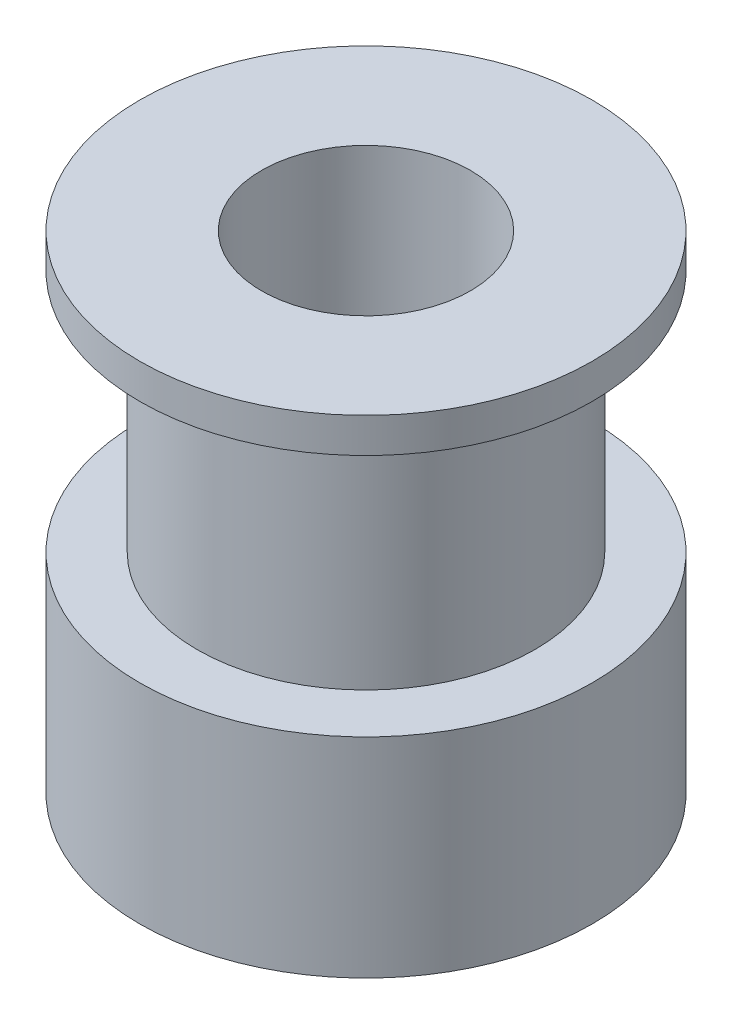
ISO-10303-21;
HEADER;
FILE_DESCRIPTION(('STEP AP214'),'2;1');
FILE_NAME('part.step','',(''),(''),'','','');
FILE_SCHEMA(('AUTOMOTIVE_DESIGN { 1 0 10303 214 1 1 1 1 }'));
ENDSEC;
DATA;
#1=APPLICATION_CONTEXT('core data for automotive mechanical design processes');
#2=APPLICATION_PROTOCOL_DEFINITION('international standard','automotive_design',2000,#1);
#3=PRODUCT_CONTEXT('',#1,'mechanical');
#4=PRODUCT('Part','Part','',(#3));
#5=PRODUCT_RELATED_PRODUCT_CATEGORY('part','',(#4));
#6=PRODUCT_DEFINITION_FORMATION('','',#4);
#7=PRODUCT_DEFINITION_CONTEXT('part definition',#1,'design');
#8=PRODUCT_DEFINITION('design','',#6,#7);
#9=PRODUCT_DEFINITION_SHAPE('','',#8);
#10=(LENGTH_UNIT() NAMED_UNIT(*) SI_UNIT(.MILLI.,.METRE.));
#11=(NAMED_UNIT(*) PLANE_ANGLE_UNIT() SI_UNIT($,.RADIAN.));
#12=(NAMED_UNIT(*) SI_UNIT($,.STERADIAN.) SOLID_ANGLE_UNIT());
#13=UNCERTAINTY_MEASURE_WITH_UNIT(LENGTH_MEASURE(1.E-05),#10,'distance_accuracy_value','');
#14=(GEOMETRIC_REPRESENTATION_CONTEXT(3) GLOBAL_UNCERTAINTY_ASSIGNED_CONTEXT((#13)) GLOBAL_UNIT_ASSIGNED_CONTEXT((#10,
#11,#12)) REPRESENTATION_CONTEXT('',''));
#15=CARTESIAN_POINT('',(0.,0.,0.));
#16=DIRECTION('',(0.,0.,1.));
#17=DIRECTION('',(1.,0.,0.));
#18=AXIS2_PLACEMENT_3D('',#15,#16,#17);
#19=CARTESIAN_POINT('',(6.5,0.,0.));
#20=DIRECTION('',(0.,-1.,0.));
#21=DIRECTION('',(0.,0.,-1.));
#22=AXIS2_PLACEMENT_3D('',#19,#20,#21);
#23=PLANE('',#22);
#24=CARTESIAN_POINT('',(0.,0.,0.));
#25=DIRECTION('',(0.,-1.,0.));
#26=DIRECTION('',(0.,0.,-1.));
#27=AXIS2_PLACEMENT_3D('',#24,#25,#26);
#28=CIRCLE('',#27,6.5);
#29=CARTESIAN_POINT('',(0.,0.,-6.5));
#30=VERTEX_POINT('',#29);
#31=EDGE_CURVE('E10',#30,#30,#28,.T.);
#32=ORIENTED_EDGE('',*,*,#31,.T.);
#33=EDGE_LOOP('',(#32));
#34=FACE_BOUND('',#33,.T.);
#35=CARTESIAN_POINT('',(0.,0.,0.));
#36=DIRECTION('',(0.,-1.,0.));
#37=DIRECTION('',(0.,0.,-1.));
#38=AXIS2_PLACEMENT_3D('',#35,#36,#37);
#39=CIRCLE('',#38,3.);
#40=CARTESIAN_POINT('',(0.,0.,-3.));
#41=VERTEX_POINT('',#40);
#42=EDGE_CURVE('E59',#41,#41,#39,.T.);
#43=ORIENTED_EDGE('',*,*,#42,.F.);
#44=EDGE_LOOP('',(#43));
#45=FACE_BOUND('',#44,.T.);
#46=ADVANCED_FACE('F31',(#34,#45),#23,.T.);
#47=CARTESIAN_POINT('',(0.,0.,0.));
#48=DIRECTION('',(0.,-1.,0.));
#49=DIRECTION('',(0.,0.,-1.));
#50=AXIS2_PLACEMENT_3D('',#47,#48,#49);
#51=CYLINDRICAL_SURFACE('',#50,6.5);
#52=CARTESIAN_POINT('',(0.,6.,0.));
#53=DIRECTION('',(0.,-1.,0.));
#54=DIRECTION('',(0.,0.,-1.));
#55=AXIS2_PLACEMENT_3D('',#52,#53,#54);
#56=CIRCLE('',#55,6.5);
#57=CARTESIAN_POINT('',(0.,6.,-6.5));
#58=VERTEX_POINT('',#57);
#59=EDGE_CURVE('E37',#58,#58,#56,.T.);
#60=ORIENTED_EDGE('',*,*,#59,.T.);
#61=EDGE_LOOP('',(#60));
#62=FACE_BOUND('',#61,.T.);
#63=ORIENTED_EDGE('',*,*,#31,.F.);
#64=EDGE_LOOP('',(#63));
#65=FACE_BOUND('',#64,.T.);
#66=ADVANCED_FACE('F67',(#62,#65),#51,.T.);
#67=CARTESIAN_POINT('',(6.5,6.,0.));
#68=DIRECTION('',(0.,1.,0.));
#69=DIRECTION('',(0.,0.,1.));
#70=AXIS2_PLACEMENT_3D('',#67,#68,#69);
#71=PLANE('',#70);
#72=CARTESIAN_POINT('',(0.,6.,0.));
#73=DIRECTION('',(0.,-1.,0.));
#74=DIRECTION('',(0.,0.,-1.));
#75=AXIS2_PLACEMENT_3D('',#72,#73,#74);
#76=CIRCLE('',#75,4.85);
#77=CARTESIAN_POINT('',(0.,6.,-4.85));
#78=VERTEX_POINT('',#77);
#79=EDGE_CURVE('E41',#78,#78,#76,.T.);
#80=ORIENTED_EDGE('',*,*,#79,.T.);
#81=EDGE_LOOP('',(#80));
#82=FACE_BOUND('',#81,.T.);
#83=ORIENTED_EDGE('',*,*,#59,.F.);
#84=EDGE_LOOP('',(#83));
#85=FACE_BOUND('',#84,.T.);
#86=ADVANCED_FACE('F71',(#82,#85),#71,.T.);
#87=CARTESIAN_POINT('',(0.,0.,0.));
#88=DIRECTION('',(0.,-1.,0.));
#89=DIRECTION('',(0.,0.,-1.));
#90=AXIS2_PLACEMENT_3D('',#87,#88,#89);
#91=CYLINDRICAL_SURFACE('',#90,4.85);
#92=CARTESIAN_POINT('',(0.,13.,0.));
#93=DIRECTION('',(0.,-1.,0.));
#94=DIRECTION('',(0.,0.,-1.));
#95=AXIS2_PLACEMENT_3D('',#92,#93,#94);
#96=CIRCLE('',#95,4.85);
#97=CARTESIAN_POINT('',(0.,13.,-4.85));
#98=VERTEX_POINT('',#97);
#99=EDGE_CURVE('E45',#98,#98,#96,.T.);
#100=ORIENTED_EDGE('',*,*,#99,.T.);
#101=EDGE_LOOP('',(#100));
#102=FACE_BOUND('',#101,.T.);
#103=ORIENTED_EDGE('',*,*,#79,.F.);
#104=EDGE_LOOP('',(#103));
#105=FACE_BOUND('',#104,.T.);
#106=ADVANCED_FACE('F75',(#102,#105),#91,.T.);
#107=CARTESIAN_POINT('',(4.85,13.,0.));
#108=DIRECTION('',(0.,-1.,0.));
#109=DIRECTION('',(0.,0.,-1.));
#110=AXIS2_PLACEMENT_3D('',#107,#108,#109);
#111=PLANE('',#110);
#112=CARTESIAN_POINT('',(0.,13.,0.));
#113=DIRECTION('',(0.,-1.,0.));
#114=DIRECTION('',(0.,0.,-1.));
#115=AXIS2_PLACEMENT_3D('',#112,#113,#114);
#116=CIRCLE('',#115,6.5);
#117=CARTESIAN_POINT('',(0.,13.,-6.5));
#118=VERTEX_POINT('',#117);
#119=EDGE_CURVE('E50',#118,#118,#116,.T.);
#120=ORIENTED_EDGE('',*,*,#119,.T.);
#121=EDGE_LOOP('',(#120));
#122=FACE_BOUND('',#121,.T.);
#123=ORIENTED_EDGE('',*,*,#99,.F.);
#124=EDGE_LOOP('',(#123));
#125=FACE_BOUND('',#124,.T.);
#126=ADVANCED_FACE('F82',(#122,#125),#111,.T.);
#127=CARTESIAN_POINT('',(0.,0.,0.));
#128=DIRECTION('',(0.,-1.,0.));
#129=DIRECTION('',(0.,0.,-1.));
#130=AXIS2_PLACEMENT_3D('',#127,#128,#129);
#131=CYLINDRICAL_SURFACE('',#130,6.5);
#132=CARTESIAN_POINT('',(0.,14.,0.));
#133=DIRECTION('',(0.,-1.,0.));
#134=DIRECTION('',(0.,0.,-1.));
#135=AXIS2_PLACEMENT_3D('',#132,#133,#134);
#136=CIRCLE('',#135,6.5);
#137=CARTESIAN_POINT('',(0.,14.,-6.5));
#138=VERTEX_POINT('',#137);
#139=EDGE_CURVE('E53',#138,#138,#136,.T.);
#140=ORIENTED_EDGE('',*,*,#139,.T.);
#141=EDGE_LOOP('',(#140));
#142=FACE_BOUND('',#141,.T.);
#143=ORIENTED_EDGE('',*,*,#119,.F.);
#144=EDGE_LOOP('',(#143));
#145=FACE_BOUND('',#144,.T.);
#146=ADVANCED_FACE('F86',(#142,#145),#131,.T.);
#147=CARTESIAN_POINT('',(6.5,14.,0.));
#148=DIRECTION('',(0.,1.,0.));
#149=DIRECTION('',(0.,0.,1.));
#150=AXIS2_PLACEMENT_3D('',#147,#148,#149);
#151=PLANE('',#150);
#152=CARTESIAN_POINT('',(0.,14.,0.));
#153=DIRECTION('',(0.,-1.,0.));
#154=DIRECTION('',(0.,0.,-1.));
#155=AXIS2_PLACEMENT_3D('',#152,#153,#154);
#156=CIRCLE('',#155,3.);
#157=CARTESIAN_POINT('',(0.,14.,-3.));
#158=VERTEX_POINT('',#157);
#159=EDGE_CURVE('E56',#158,#158,#156,.T.);
#160=ORIENTED_EDGE('',*,*,#159,.T.);
#161=EDGE_LOOP('',(#160));
#162=FACE_BOUND('',#161,.T.);
#163=ORIENTED_EDGE('',*,*,#139,.F.);
#164=EDGE_LOOP('',(#163));
#165=FACE_BOUND('',#164,.T.);
#166=ADVANCED_FACE('F90',(#162,#165),#151,.T.);
#167=CARTESIAN_POINT('',(0.,0.,0.));
#168=DIRECTION('',(0.,-1.,0.));
#169=DIRECTION('',(0.,0.,-1.));
#170=AXIS2_PLACEMENT_3D('',#167,#168,#169);
#171=CYLINDRICAL_SURFACE('',#170,3.);
#172=ORIENTED_EDGE('',*,*,#42,.T.);
#173=EDGE_LOOP('',(#172));
#174=FACE_BOUND('',#173,.T.);
#175=ORIENTED_EDGE('',*,*,#159,.F.);
#176=EDGE_LOOP('',(#175));
#177=FACE_BOUND('',#176,.T.);
#178=ADVANCED_FACE('F63',(#174,#177),#171,.F.);
#179=CLOSED_SHELL('',(#46,#66,#86,#106,#126,#146,#166,#178));
#180=MANIFOLD_SOLID_BREP('B2',#179);
#181=ADVANCED_BREP_SHAPE_REPRESENTATION('',(#18,#180),#14);
#182=SHAPE_DEFINITION_REPRESENTATION(#9,#181);
ENDSEC;
END-ISO-10303-21;
